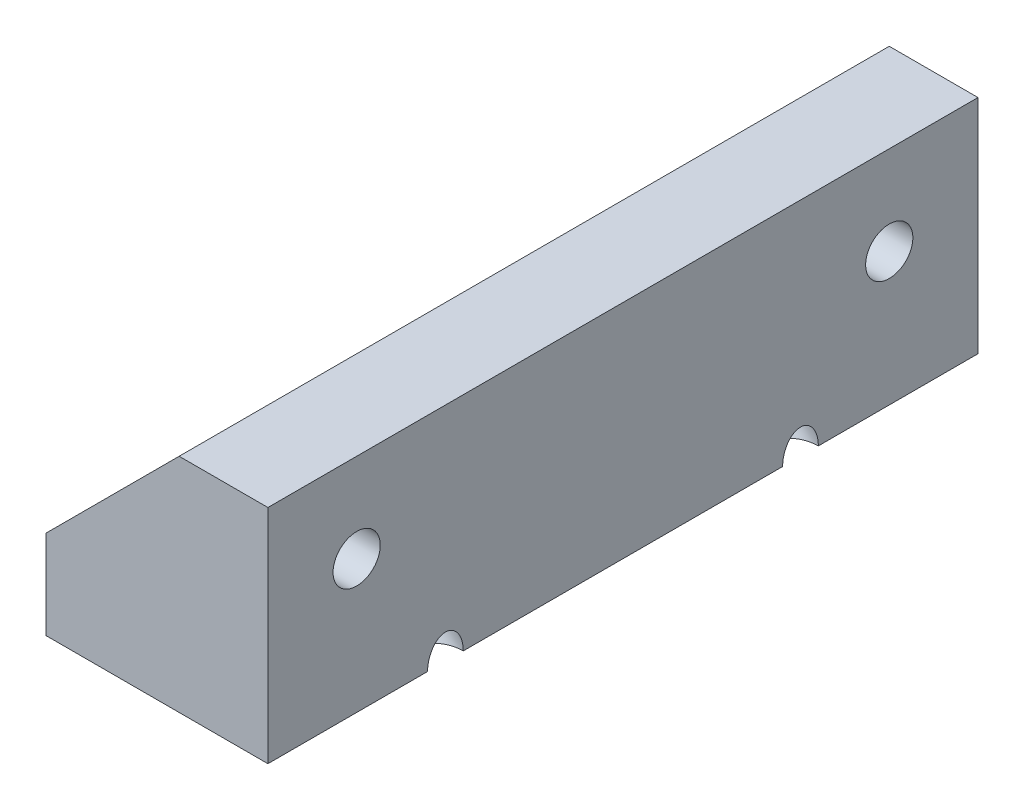
ISO-10303-21;
HEADER;
FILE_DESCRIPTION(('STEP AP214'),'2;1');
FILE_NAME('part.step','',(''),(''),'','','');
FILE_SCHEMA(('AUTOMOTIVE_DESIGN { 1 0 10303 214 1 1 1 1 }'));
ENDSEC;
DATA;
#1=APPLICATION_CONTEXT('core data for automotive mechanical design processes');
#2=APPLICATION_PROTOCOL_DEFINITION('international standard','automotive_design',2000,#1);
#3=PRODUCT_CONTEXT('',#1,'mechanical');
#4=PRODUCT('Part','Part','',(#3));
#5=PRODUCT_RELATED_PRODUCT_CATEGORY('part','',(#4));
#6=PRODUCT_DEFINITION_FORMATION('','',#4);
#7=PRODUCT_DEFINITION_CONTEXT('part definition',#1,'design');
#8=PRODUCT_DEFINITION('design','',#6,#7);
#9=PRODUCT_DEFINITION_SHAPE('','',#8);
#10=(LENGTH_UNIT() NAMED_UNIT(*) SI_UNIT(.MILLI.,.METRE.));
#11=(NAMED_UNIT(*) PLANE_ANGLE_UNIT() SI_UNIT($,.RADIAN.));
#12=(NAMED_UNIT(*) SI_UNIT($,.STERADIAN.) SOLID_ANGLE_UNIT());
#13=UNCERTAINTY_MEASURE_WITH_UNIT(LENGTH_MEASURE(1.E-05),#10,'distance_accuracy_value','');
#14=(GEOMETRIC_REPRESENTATION_CONTEXT(3) GLOBAL_UNCERTAINTY_ASSIGNED_CONTEXT((#13)) GLOBAL_UNIT_ASSIGNED_CONTEXT((#10,
#11,#12)) REPRESENTATION_CONTEXT('',''));
#15=CARTESIAN_POINT('',(0.,0.,0.));
#16=DIRECTION('',(0.,0.,1.));
#17=DIRECTION('',(1.,0.,0.));
#18=AXIS2_PLACEMENT_3D('',#15,#16,#17);
#19=CARTESIAN_POINT('',(3.175,15.875,-50.801));
#20=DIRECTION('',(0.707106781186551,-0.707106781186544,0.));
#21=DIRECTION('',(0.707106781186544,0.707106781186551,0.));
#22=AXIS2_PLACEMENT_3D('',#19,#20,#21);
#23=PLANE('',#22);
#24=CARTESIAN_POINT('',(-9.52499999999986,3.175,-38.1));
#25=DIRECTION('',(0.707106781186551,-0.707106781186544,0.));
#26=DIRECTION('',(-0.707106781186544,-0.707106781186551,0.));
#27=AXIS2_PLACEMENT_3D('',#24,#25,#26);
#28=ELLIPSE('',#27,7.85772410593546,5.55625);
#29=CARTESIAN_POINT('',(-15.0812499999998,-2.38125,-38.1));
#30=VERTEX_POINT('',#29);
#31=EDGE_CURVE('E60',#30,#30,#28,.T.);
#32=ORIENTED_EDGE('',*,*,#31,.T.);
#33=EDGE_LOOP('',(#32));
#34=FACE_BOUND('',#33,.T.);
#35=CARTESIAN_POINT('',(-9.52499999999986,3.175,38.1));
#36=DIRECTION('',(0.707106781186551,-0.707106781186544,0.));
#37=DIRECTION('',(-0.707106781186544,-0.707106781186551,0.));
#38=AXIS2_PLACEMENT_3D('',#35,#36,#37);
#39=ELLIPSE('',#38,7.85772410593546,5.55625);
#40=CARTESIAN_POINT('',(-15.0812499999998,-2.38125,38.1));
#41=VERTEX_POINT('',#40);
#42=EDGE_CURVE('E149',#41,#41,#39,.T.);
#43=ORIENTED_EDGE('',*,*,#42,.T.);
#44=EDGE_LOOP('',(#43));
#45=FACE_BOUND('',#44,.T.);
#46=CARTESIAN_POINT('',(-6.34999999999999,6.34999999999992,-25.4));
#47=DIRECTION('',(-0.707106781186551,0.707106781186544,0.));
#48=DIRECTION('',(-0.707106781186544,-0.707106781186551,0.));
#49=AXIS2_PLACEMENT_3D('',#46,#47,#48);
#50=CIRCLE('',#49,2.55269999999999);
#51=CARTESIAN_POINT('',(-8.15503148033487,4.54496851966502,-25.4));
#52=VERTEX_POINT('',#51);
#53=EDGE_CURVE('E125',#52,#52,#50,.T.);
#54=ORIENTED_EDGE('',*,*,#53,.F.);
#55=EDGE_LOOP('',(#54));
#56=FACE_BOUND('',#55,.T.);
#57=DIRECTION('',(0.,0.,1.));
#58=VECTOR('',#57,1.);
#59=CARTESIAN_POINT('',(-15.875,-3.17500000000021,-50.801));
#60=LINE('',#59,#58);
#61=CARTESIAN_POINT('',(-15.875,-3.17500000000021,-50.8));
#62=VERTEX_POINT('',#61);
#63=CARTESIAN_POINT('',(-15.875,-3.17500000000021,50.8));
#64=VERTEX_POINT('',#63);
#65=EDGE_CURVE('E175',#62,#64,#60,.T.);
#66=ORIENTED_EDGE('',*,*,#65,.T.);
#67=DIRECTION('',(0.707106781186544,0.707106781186551,0.));
#68=VECTOR('',#67,1.);
#69=CARTESIAN_POINT('',(3.175,15.875,50.8));
#70=LINE('',#69,#68);
#71=CARTESIAN_POINT('',(3.175,15.875,50.8));
#72=VERTEX_POINT('',#71);
#73=EDGE_CURVE('E172',#64,#72,#70,.T.);
#74=ORIENTED_EDGE('',*,*,#73,.T.);
#75=DIRECTION('',(0.,0.,1.));
#76=VECTOR('',#75,1.);
#77=CARTESIAN_POINT('',(3.175,15.875,-50.801));
#78=LINE('',#77,#76);
#79=CARTESIAN_POINT('',(3.175,15.875,-50.8));
#80=VERTEX_POINT('',#79);
#81=EDGE_CURVE('E174',#80,#72,#78,.T.);
#82=ORIENTED_EDGE('',*,*,#81,.F.);
#83=DIRECTION('',(0.707106781186544,0.707106781186551,0.));
#84=VECTOR('',#83,1.);
#85=CARTESIAN_POINT('',(3.175,15.875,-50.8));
#86=LINE('',#85,#84);
#87=EDGE_CURVE('E169',#62,#80,#86,.T.);
#88=ORIENTED_EDGE('',*,*,#87,.F.);
#89=EDGE_LOOP('',(#66,#74,#82,#88));
#90=FACE_BOUND('',#89,.T.);
#91=CARTESIAN_POINT('',(-6.34999999999999,6.34999999999992,25.4));
#92=DIRECTION('',(-0.707106781186551,0.707106781186544,0.));
#93=DIRECTION('',(-0.707106781186544,-0.707106781186551,0.));
#94=AXIS2_PLACEMENT_3D('',#91,#92,#93);
#95=CIRCLE('',#94,2.55269999999999);
#96=CARTESIAN_POINT('',(-8.15503148033487,4.54496851966502,25.4));
#97=VERTEX_POINT('',#96);
#98=EDGE_CURVE('E124',#97,#97,#95,.T.);
#99=ORIENTED_EDGE('',*,*,#98,.F.);
#100=EDGE_LOOP('',(#99));
#101=FACE_BOUND('',#100,.T.);
#102=ADVANCED_FACE('F56',(#34,#45,#56,#90,#101),#23,.F.);
#103=CARTESIAN_POINT('',(-15.875,15.875,50.8));
#104=DIRECTION('',(-1.,0.,0.));
#105=DIRECTION('',(0.,0.,1.));
#106=AXIS2_PLACEMENT_3D('',#103,#104,#105);
#107=PLANE('',#106);
#108=ORIENTED_EDGE('',*,*,#65,.F.);
#109=DIRECTION('',(0.,-1.,0.));
#110=VECTOR('',#109,1.);
#111=CARTESIAN_POINT('',(-15.875,15.875,-50.8));
#112=LINE('',#111,#110);
#113=CARTESIAN_POINT('',(-15.875,-15.875,-50.8));
#114=VERTEX_POINT('',#113);
#115=EDGE_CURVE('E146',#62,#114,#112,.T.);
#116=ORIENTED_EDGE('',*,*,#115,.T.);
#117=DIRECTION('',(0.,0.,-1.));
#118=VECTOR('',#117,1.);
#119=CARTESIAN_POINT('',(-15.875,-15.875,50.8));
#120=LINE('',#119,#118);
#121=CARTESIAN_POINT('',(-15.875,-15.875,50.8));
#122=VERTEX_POINT('',#121);
#123=EDGE_CURVE('E177',#122,#114,#120,.T.);
#124=ORIENTED_EDGE('',*,*,#123,.F.);
#125=DIRECTION('',(0.,-1.,0.));
#126=VECTOR('',#125,1.);
#127=CARTESIAN_POINT('',(-15.875,15.875,50.8));
#128=LINE('',#127,#126);
#129=EDGE_CURVE('E138',#64,#122,#128,.T.);
#130=ORIENTED_EDGE('',*,*,#129,.F.);
#131=EDGE_LOOP('',(#108,#116,#124,#130));
#132=FACE_BOUND('',#131,.T.);
#133=ADVANCED_FACE('F58',(#132),#107,.T.);
#134=CARTESIAN_POINT('',(-15.875,15.875,50.8));
#135=DIRECTION('',(0.,0.,-1.));
#136=DIRECTION('',(-1.,0.,0.));
#137=AXIS2_PLACEMENT_3D('',#134,#135,#136);
#138=PLANE('',#137);
#139=DIRECTION('',(1.,0.,0.));
#140=VECTOR('',#139,1.);
#141=CARTESIAN_POINT('',(-15.875,15.875,50.8));
#142=LINE('',#141,#140);
#143=CARTESIAN_POINT('',(15.875,15.875,50.8));
#144=VERTEX_POINT('',#143);
#145=EDGE_CURVE('E148',#72,#144,#142,.T.);
#146=ORIENTED_EDGE('',*,*,#145,.F.);
#147=ORIENTED_EDGE('',*,*,#73,.F.);
#148=ORIENTED_EDGE('',*,*,#129,.T.);
#149=DIRECTION('',(1.,0.,0.));
#150=VECTOR('',#149,1.);
#151=CARTESIAN_POINT('',(-15.875,-15.875,50.8));
#152=LINE('',#151,#150);
#153=CARTESIAN_POINT('',(15.875,-15.875,50.8));
#154=VERTEX_POINT('',#153);
#155=EDGE_CURVE('E131',#122,#154,#152,.T.);
#156=ORIENTED_EDGE('',*,*,#155,.T.);
#157=DIRECTION('',(0.,-1.,0.));
#158=VECTOR('',#157,1.);
#159=CARTESIAN_POINT('',(15.875,15.875,50.8));
#160=LINE('',#159,#158);
#161=EDGE_CURVE('E140',#144,#154,#160,.T.);
#162=ORIENTED_EDGE('',*,*,#161,.F.);
#163=EDGE_LOOP('',(#146,#147,#148,#156,#162));
#164=FACE_BOUND('',#163,.T.);
#165=ADVANCED_FACE('F201',(#164),#138,.F.);
#166=CARTESIAN_POINT('',(15.875,15.875,50.8));
#167=DIRECTION('',(-1.,0.,0.));
#168=DIRECTION('',(0.,0.,1.));
#169=AXIS2_PLACEMENT_3D('',#166,#167,#168);
#170=PLANE('',#169);
#171=CARTESIAN_POINT('',(15.875,3.175,-38.1));
#172=DIRECTION('',(-1.,0.,0.));
#173=DIRECTION('',(0.,0.,1.));
#174=AXIS2_PLACEMENT_3D('',#171,#172,#173);
#175=CIRCLE('',#174,3.37819999999999);
#176=CARTESIAN_POINT('',(15.875,3.175,-34.7218));
#177=VERTEX_POINT('',#176);
#178=EDGE_CURVE('E339',#177,#177,#175,.T.);
#179=ORIENTED_EDGE('',*,*,#178,.T.);
#180=EDGE_LOOP('',(#179));
#181=FACE_BOUND('',#180,.T.);
#182=CARTESIAN_POINT('',(15.875,3.175,38.1));
#183=DIRECTION('',(-1.,0.,0.));
#184=DIRECTION('',(0.,0.,1.));
#185=AXIS2_PLACEMENT_3D('',#182,#183,#184);
#186=CIRCLE('',#185,3.37819999999999);
#187=CARTESIAN_POINT('',(15.875,3.175,41.4782));
#188=VERTEX_POINT('',#187);
#189=EDGE_CURVE('E151',#188,#188,#186,.T.);
#190=ORIENTED_EDGE('',*,*,#189,.T.);
#191=EDGE_LOOP('',(#190));
#192=FACE_BOUND('',#191,.T.);
#193=DIRECTION('',(0.,0.,-1.));
#194=VECTOR('',#193,1.);
#195=CARTESIAN_POINT('',(15.875,-15.875,50.8));
#196=LINE('',#195,#194);
#197=CARTESIAN_POINT('',(15.875,-15.875,22.8473));
#198=VERTEX_POINT('',#197);
#199=CARTESIAN_POINT('',(15.875,-15.875,-22.8473));
#200=VERTEX_POINT('',#199);
#201=EDGE_CURVE('E121',#198,#200,#196,.T.);
#202=ORIENTED_EDGE('',*,*,#201,.T.);
#203=CARTESIAN_POINT('',(15.875,-15.8749999999998,-25.4));
#204=DIRECTION('',(-1.,0.,0.));
#205=DIRECTION('',(0.,1.,0.));
#206=AXIS2_PLACEMENT_3D('',#203,#204,#205);
#207=ELLIPSE('',#206,3.61006296066977,2.55269999999999);
#208=CARTESIAN_POINT('',(15.875,-15.875,-27.9527));
#209=VERTEX_POINT('',#208);
#210=EDGE_CURVE('E13',#200,#209,#207,.T.);
#211=ORIENTED_EDGE('',*,*,#210,.T.);
#212=CARTESIAN_POINT('',(15.875,-15.875,-50.8));
#213=VERTEX_POINT('',#212);
#214=EDGE_CURVE('E123',#209,#213,#196,.T.);
#215=ORIENTED_EDGE('',*,*,#214,.T.);
#216=DIRECTION('',(0.,-1.,0.));
#217=VECTOR('',#216,1.);
#218=CARTESIAN_POINT('',(15.875,15.875,-50.8));
#219=LINE('',#218,#217);
#220=CARTESIAN_POINT('',(15.875,15.875,-50.8));
#221=VERTEX_POINT('',#220);
#222=EDGE_CURVE('E143',#221,#213,#219,.T.);
#223=ORIENTED_EDGE('',*,*,#222,.F.);
#224=DIRECTION('',(0.,0.,-1.));
#225=VECTOR('',#224,1.);
#226=CARTESIAN_POINT('',(15.875,15.875,50.8));
#227=LINE('',#226,#225);
#228=EDGE_CURVE('E181',#144,#221,#227,.T.);
#229=ORIENTED_EDGE('',*,*,#228,.F.);
#230=ORIENTED_EDGE('',*,*,#161,.T.);
#231=CARTESIAN_POINT('',(15.875,-15.875,27.9527));
#232=VERTEX_POINT('',#231);
#233=EDGE_CURVE('E129',#154,#232,#196,.T.);
#234=ORIENTED_EDGE('',*,*,#233,.T.);
#235=CARTESIAN_POINT('',(15.875,-15.8749999999998,25.4));
#236=DIRECTION('',(-1.,0.,0.));
#237=DIRECTION('',(0.,1.,0.));
#238=AXIS2_PLACEMENT_3D('',#235,#236,#237);
#239=ELLIPSE('',#238,3.61006296066977,2.55269999999999);
#240=EDGE_CURVE('E65',#232,#198,#239,.T.);
#241=ORIENTED_EDGE('',*,*,#240,.T.);
#242=EDGE_LOOP('',(#202,#211,#215,#223,#229,#230,#234,#241));
#243=FACE_BOUND('',#242,.T.);
#244=ADVANCED_FACE('F127',(#181,#192,#243),#170,.F.);
#245=CARTESIAN_POINT('',(-15.875,15.875,-50.8));
#246=DIRECTION('',(0.,0.,-1.));
#247=DIRECTION('',(-1.,0.,0.));
#248=AXIS2_PLACEMENT_3D('',#245,#246,#247);
#249=PLANE('',#248);
#250=ORIENTED_EDGE('',*,*,#87,.T.);
#251=DIRECTION('',(1.,0.,0.));
#252=VECTOR('',#251,1.);
#253=CARTESIAN_POINT('',(-15.875,15.875,-50.8));
#254=LINE('',#253,#252);
#255=EDGE_CURVE('E137',#80,#221,#254,.T.);
#256=ORIENTED_EDGE('',*,*,#255,.T.);
#257=ORIENTED_EDGE('',*,*,#222,.T.);
#258=DIRECTION('',(1.,0.,0.));
#259=VECTOR('',#258,1.);
#260=CARTESIAN_POINT('',(-15.875,-15.875,-50.8));
#261=LINE('',#260,#259);
#262=EDGE_CURVE('E132',#114,#213,#261,.T.);
#263=ORIENTED_EDGE('',*,*,#262,.F.);
#264=ORIENTED_EDGE('',*,*,#115,.F.);
#265=EDGE_LOOP('',(#250,#256,#257,#263,#264));
#266=FACE_BOUND('',#265,.T.);
#267=ADVANCED_FACE('F190',(#266),#249,.T.);
#268=CARTESIAN_POINT('',(0.,15.875,0.));
#269=DIRECTION('',(0.,-1.,0.));
#270=DIRECTION('',(0.,0.,-1.));
#271=AXIS2_PLACEMENT_3D('',#268,#269,#270);
#272=PLANE('',#271);
#273=ORIENTED_EDGE('',*,*,#255,.F.);
#274=ORIENTED_EDGE('',*,*,#81,.T.);
#275=ORIENTED_EDGE('',*,*,#145,.T.);
#276=ORIENTED_EDGE('',*,*,#228,.T.);
#277=EDGE_LOOP('',(#273,#274,#275,#276));
#278=FACE_BOUND('',#277,.T.);
#279=ADVANCED_FACE('F197',(#278),#272,.F.);
#280=CARTESIAN_POINT('',(0.,-15.875,0.));
#281=DIRECTION('',(0.,-1.,0.));
#282=DIRECTION('',(0.,0.,-1.));
#283=AXIS2_PLACEMENT_3D('',#280,#281,#282);
#284=PLANE('',#283);
#285=CARTESIAN_POINT('',(15.8750000000002,-15.875,-25.4));
#286=DIRECTION('',(0.,-1.,0.));
#287=DIRECTION('',(-1.,0.,0.));
#288=AXIS2_PLACEMENT_3D('',#285,#286,#287);
#289=ELLIPSE('',#288,3.6100629606698,2.55269999999999);
#290=EDGE_CURVE('E72',#200,#209,#289,.T.);
#291=ORIENTED_EDGE('',*,*,#290,.F.);
#292=ORIENTED_EDGE('',*,*,#201,.F.);
#293=CARTESIAN_POINT('',(15.8750000000002,-15.875,25.4));
#294=DIRECTION('',(0.,-1.,0.));
#295=DIRECTION('',(-1.,0.,0.));
#296=AXIS2_PLACEMENT_3D('',#293,#294,#295);
#297=ELLIPSE('',#296,3.6100629606698,2.55269999999999);
#298=EDGE_CURVE('E78',#232,#198,#297,.T.);
#299=ORIENTED_EDGE('',*,*,#298,.F.);
#300=ORIENTED_EDGE('',*,*,#233,.F.);
#301=ORIENTED_EDGE('',*,*,#155,.F.);
#302=ORIENTED_EDGE('',*,*,#123,.T.);
#303=ORIENTED_EDGE('',*,*,#262,.T.);
#304=ORIENTED_EDGE('',*,*,#214,.F.);
#305=EDGE_LOOP('',(#291,#292,#299,#300,#301,#302,#303,#304));
#306=FACE_BOUND('',#305,.T.);
#307=ADVANCED_FACE('F120',(#306),#284,.T.);
#308=CARTESIAN_POINT('',(-6.34999999999999,6.34999999999992,25.4));
#309=DIRECTION('',(-0.707106781186551,0.707106781186544,0.));
#310=DIRECTION('',(-0.707106781186544,-0.707106781186551,0.));
#311=AXIS2_PLACEMENT_3D('',#308,#309,#310);
#312=CYLINDRICAL_SURFACE('',#311,2.55269999999999);
#313=ORIENTED_EDGE('',*,*,#298,.T.);
#314=ORIENTED_EDGE('',*,*,#240,.F.);
#315=EDGE_LOOP('',(#313,#314));
#316=FACE_BOUND('',#315,.T.);
#317=ORIENTED_EDGE('',*,*,#98,.T.);
#318=EDGE_LOOP('',(#317));
#319=FACE_BOUND('',#318,.T.);
#320=ADVANCED_FACE('F212',(#316,#319),#312,.F.);
#321=CARTESIAN_POINT('',(-6.34999999999999,6.34999999999992,-25.4));
#322=DIRECTION('',(-0.707106781186551,0.707106781186544,0.));
#323=DIRECTION('',(-0.707106781186544,-0.707106781186551,0.));
#324=AXIS2_PLACEMENT_3D('',#321,#322,#323);
#325=CYLINDRICAL_SURFACE('',#324,2.55269999999999);
#326=ORIENTED_EDGE('',*,*,#290,.T.);
#327=ORIENTED_EDGE('',*,*,#210,.F.);
#328=EDGE_LOOP('',(#326,#327));
#329=FACE_BOUND('',#328,.T.);
#330=ORIENTED_EDGE('',*,*,#53,.T.);
#331=EDGE_LOOP('',(#330));
#332=FACE_BOUND('',#331,.T.);
#333=ADVANCED_FACE('F113',(#329,#332),#325,.F.);
#334=CARTESIAN_POINT('',(-15.875,3.175,38.1));
#335=DIRECTION('',(-1.,0.,0.));
#336=DIRECTION('',(0.,0.,1.));
#337=AXIS2_PLACEMENT_3D('',#334,#335,#336);
#338=CYLINDRICAL_SURFACE('',#337,5.55625);
#339=CARTESIAN_POINT('',(4.445,3.175,38.1));
#340=DIRECTION('',(-1.,0.,0.));
#341=DIRECTION('',(0.,0.,1.));
#342=AXIS2_PLACEMENT_3D('',#339,#340,#341);
#343=CIRCLE('',#342,5.55625);
#344=CARTESIAN_POINT('',(4.445,3.175,43.65625));
#345=VERTEX_POINT('',#344);
#346=EDGE_CURVE('E162',#345,#345,#343,.T.);
#347=ORIENTED_EDGE('',*,*,#346,.F.);
#348=EDGE_LOOP('',(#347));
#349=FACE_BOUND('',#348,.T.);
#350=ORIENTED_EDGE('',*,*,#42,.F.);
#351=EDGE_LOOP('',(#350));
#352=FACE_BOUND('',#351,.T.);
#353=ADVANCED_FACE('F218',(#349,#352),#338,.F.);
#354=CARTESIAN_POINT('',(-15.875,3.175,38.1));
#355=DIRECTION('',(-1.,0.,0.));
#356=DIRECTION('',(0.,0.,1.));
#357=AXIS2_PLACEMENT_3D('',#354,#355,#356);
#358=CYLINDRICAL_SURFACE('',#357,3.37819999999999);
#359=ORIENTED_EDGE('',*,*,#189,.F.);
#360=EDGE_LOOP('',(#359));
#361=FACE_BOUND('',#360,.T.);
#362=CARTESIAN_POINT('',(4.445,3.175,38.1));
#363=DIRECTION('',(-1.,0.,0.));
#364=DIRECTION('',(0.,0.,1.));
#365=AXIS2_PLACEMENT_3D('',#362,#363,#364);
#366=CIRCLE('',#365,3.3782);
#367=CARTESIAN_POINT('',(4.445,3.175,41.4782));
#368=VERTEX_POINT('',#367);
#369=EDGE_CURVE('E157',#368,#368,#366,.T.);
#370=ORIENTED_EDGE('',*,*,#369,.T.);
#371=EDGE_LOOP('',(#370));
#372=FACE_BOUND('',#371,.T.);
#373=ADVANCED_FACE('F278',(#361,#372),#358,.F.);
#374=CARTESIAN_POINT('',(4.445,6.5532,38.1));
#375=DIRECTION('',(1.,0.,0.));
#376=DIRECTION('',(0.,0.,-1.));
#377=AXIS2_PLACEMENT_3D('',#374,#375,#376);
#378=PLANE('',#377);
#379=ORIENTED_EDGE('',*,*,#369,.F.);
#380=EDGE_LOOP('',(#379));
#381=FACE_BOUND('',#380,.T.);
#382=ORIENTED_EDGE('',*,*,#346,.T.);
#383=EDGE_LOOP('',(#382));
#384=FACE_BOUND('',#383,.T.);
#385=ADVANCED_FACE('F288',(#381,#384),#378,.F.);
#386=CARTESIAN_POINT('',(-15.875,3.175,-38.1));
#387=DIRECTION('',(-1.,0.,0.));
#388=DIRECTION('',(0.,0.,1.));
#389=AXIS2_PLACEMENT_3D('',#386,#387,#388);
#390=CYLINDRICAL_SURFACE('',#389,5.55625);
#391=CARTESIAN_POINT('',(4.445,3.175,-38.1));
#392=DIRECTION('',(-1.,0.,0.));
#393=DIRECTION('',(0.,0.,1.));
#394=AXIS2_PLACEMENT_3D('',#391,#392,#393);
#395=CIRCLE('',#394,5.55625);
#396=CARTESIAN_POINT('',(4.445,3.175,-32.54375));
#397=VERTEX_POINT('',#396);
#398=EDGE_CURVE('E337',#397,#397,#395,.T.);
#399=ORIENTED_EDGE('',*,*,#398,.F.);
#400=EDGE_LOOP('',(#399));
#401=FACE_BOUND('',#400,.T.);
#402=ORIENTED_EDGE('',*,*,#31,.F.);
#403=EDGE_LOOP('',(#402));
#404=FACE_BOUND('',#403,.T.);
#405=ADVANCED_FACE('F297',(#401,#404),#390,.F.);
#406=CARTESIAN_POINT('',(-15.875,3.175,-38.1));
#407=DIRECTION('',(-1.,0.,0.));
#408=DIRECTION('',(0.,0.,1.));
#409=AXIS2_PLACEMENT_3D('',#406,#407,#408);
#410=CYLINDRICAL_SURFACE('',#409,3.37819999999999);
#411=ORIENTED_EDGE('',*,*,#178,.F.);
#412=EDGE_LOOP('',(#411));
#413=FACE_BOUND('',#412,.T.);
#414=CARTESIAN_POINT('',(4.445,3.175,-38.1));
#415=DIRECTION('',(-1.,0.,0.));
#416=DIRECTION('',(0.,0.,1.));
#417=AXIS2_PLACEMENT_3D('',#414,#415,#416);
#418=CIRCLE('',#417,3.3782);
#419=CARTESIAN_POINT('',(4.445,3.175,-34.7218));
#420=VERTEX_POINT('',#419);
#421=EDGE_CURVE('E334',#420,#420,#418,.T.);
#422=ORIENTED_EDGE('',*,*,#421,.T.);
#423=EDGE_LOOP('',(#422));
#424=FACE_BOUND('',#423,.T.);
#425=ADVANCED_FACE('F307',(#413,#424),#410,.F.);
#426=CARTESIAN_POINT('',(4.445,6.5532,-38.1));
#427=DIRECTION('',(1.,0.,0.));
#428=DIRECTION('',(0.,0.,-1.));
#429=AXIS2_PLACEMENT_3D('',#426,#427,#428);
#430=PLANE('',#429);
#431=ORIENTED_EDGE('',*,*,#421,.F.);
#432=EDGE_LOOP('',(#431));
#433=FACE_BOUND('',#432,.T.);
#434=ORIENTED_EDGE('',*,*,#398,.T.);
#435=EDGE_LOOP('',(#434));
#436=FACE_BOUND('',#435,.T.);
#437=ADVANCED_FACE('F317',(#433,#436),#430,.F.);
#438=CLOSED_SHELL('',(#102,#133,#165,#244,#267,#279,#307,#320,#333,#353,#373,#385,#405,#425,#437));
#439=MANIFOLD_SOLID_BREP('B2',#438);
#440=ADVANCED_BREP_SHAPE_REPRESENTATION('',(#18,#439),#14);
#441=SHAPE_DEFINITION_REPRESENTATION(#9,#440);
ENDSEC;
END-ISO-10303-21;
